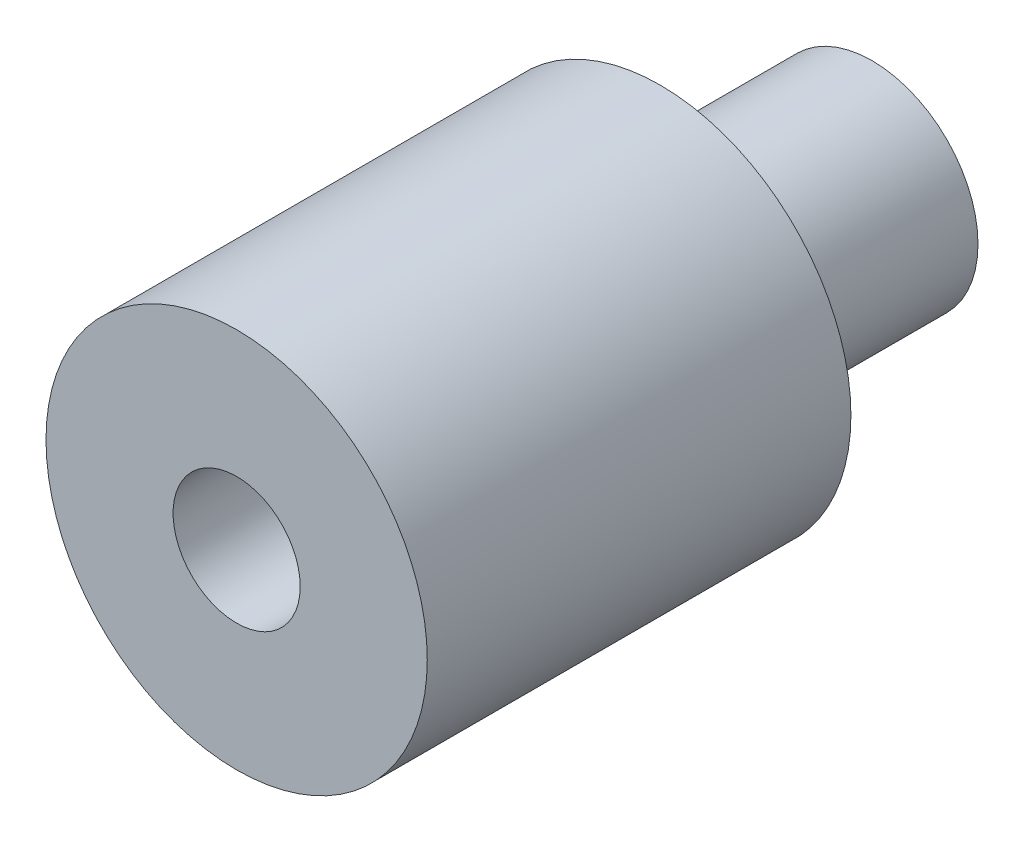
ISO-10303-21;
HEADER;
FILE_DESCRIPTION(('STEP AP214'),'2;1');
FILE_NAME('part.step','',(''),(''),'','','');
FILE_SCHEMA(('AUTOMOTIVE_DESIGN { 1 0 10303 214 1 1 1 1 }'));
ENDSEC;
DATA;
#1=APPLICATION_CONTEXT('core data for automotive mechanical design processes');
#2=APPLICATION_PROTOCOL_DEFINITION('international standard','automotive_design',2000,#1);
#3=PRODUCT_CONTEXT('',#1,'mechanical');
#4=PRODUCT('Part','Part','',(#3));
#5=PRODUCT_RELATED_PRODUCT_CATEGORY('part','',(#4));
#6=PRODUCT_DEFINITION_FORMATION('','',#4);
#7=PRODUCT_DEFINITION_CONTEXT('part definition',#1,'design');
#8=PRODUCT_DEFINITION('design','',#6,#7);
#9=PRODUCT_DEFINITION_SHAPE('','',#8);
#10=(LENGTH_UNIT() NAMED_UNIT(*) SI_UNIT(.MILLI.,.METRE.));
#11=(NAMED_UNIT(*) PLANE_ANGLE_UNIT() SI_UNIT($,.RADIAN.));
#12=(NAMED_UNIT(*) SI_UNIT($,.STERADIAN.) SOLID_ANGLE_UNIT());
#13=UNCERTAINTY_MEASURE_WITH_UNIT(LENGTH_MEASURE(1.E-05),#10,'distance_accuracy_value','');
#14=(GEOMETRIC_REPRESENTATION_CONTEXT(3) GLOBAL_UNCERTAINTY_ASSIGNED_CONTEXT((#13)) GLOBAL_UNIT_ASSIGNED_CONTEXT((#10,
#11,#12)) REPRESENTATION_CONTEXT('',''));
#15=CARTESIAN_POINT('',(0.,0.,0.));
#16=DIRECTION('',(0.,0.,1.));
#17=DIRECTION('',(1.,0.,0.));
#18=AXIS2_PLACEMENT_3D('',#15,#16,#17);
#19=CARTESIAN_POINT('',(0.,0.,5.));
#20=DIRECTION('',(0.,0.,-1.));
#21=DIRECTION('',(-1.,0.,0.));
#22=AXIS2_PLACEMENT_3D('',#19,#20,#21);
#23=CYLINDRICAL_SURFACE('',#22,2.5);
#24=CARTESIAN_POINT('',(0.,0.,5.));
#25=DIRECTION('',(0.,0.,1.));
#26=DIRECTION('',(1.,0.,0.));
#27=AXIS2_PLACEMENT_3D('',#24,#25,#26);
#28=CIRCLE('',#27,2.5);
#29=CARTESIAN_POINT('',(2.5,0.,5.));
#30=VERTEX_POINT('',#29);
#31=EDGE_CURVE('E10',#30,#30,#28,.T.);
#32=ORIENTED_EDGE('',*,*,#31,.F.);
#33=EDGE_LOOP('',(#32));
#34=FACE_BOUND('',#33,.T.);
#35=CARTESIAN_POINT('',(0.,0.,0.));
#36=DIRECTION('',(0.,0.,1.));
#37=DIRECTION('',(1.,0.,0.));
#38=AXIS2_PLACEMENT_3D('',#35,#36,#37);
#39=CIRCLE('',#38,2.5);
#40=CARTESIAN_POINT('',(2.5,0.,0.));
#41=VERTEX_POINT('',#40);
#42=EDGE_CURVE('E40',#41,#41,#39,.T.);
#43=ORIENTED_EDGE('',*,*,#42,.T.);
#44=EDGE_LOOP('',(#43));
#45=FACE_BOUND('',#44,.T.);
#46=ADVANCED_FACE('F37',(#34,#45),#23,.T.);
#47=CARTESIAN_POINT('',(0.,0.,0.));
#48=DIRECTION('',(0.,0.,1.));
#49=DIRECTION('',(1.,0.,0.));
#50=AXIS2_PLACEMENT_3D('',#47,#48,#49);
#51=PLANE('',#50);
#52=ORIENTED_EDGE('',*,*,#42,.F.);
#53=EDGE_LOOP('',(#52));
#54=FACE_BOUND('',#53,.T.);
#55=ADVANCED_FACE('F79',(#54),#51,.F.);
#56=CARTESIAN_POINT('',(0.,0.,15.));
#57=DIRECTION('',(0.,0.,-1.));
#58=DIRECTION('',(-1.,0.,0.));
#59=AXIS2_PLACEMENT_3D('',#56,#57,#58);
#60=CYLINDRICAL_SURFACE('',#59,4.5);
#61=CARTESIAN_POINT('',(0.,0.,15.));
#62=DIRECTION('',(0.,0.,1.));
#63=DIRECTION('',(1.,0.,0.));
#64=AXIS2_PLACEMENT_3D('',#61,#62,#63);
#65=CIRCLE('',#64,4.5);
#66=CARTESIAN_POINT('',(4.5,0.,15.));
#67=VERTEX_POINT('',#66);
#68=EDGE_CURVE('E47',#67,#67,#65,.T.);
#69=ORIENTED_EDGE('',*,*,#68,.F.);
#70=EDGE_LOOP('',(#69));
#71=FACE_BOUND('',#70,.T.);
#72=CARTESIAN_POINT('',(0.,0.,5.));
#73=DIRECTION('',(0.,0.,1.));
#74=DIRECTION('',(1.,0.,0.));
#75=AXIS2_PLACEMENT_3D('',#72,#73,#74);
#76=CIRCLE('',#75,4.5);
#77=CARTESIAN_POINT('',(4.5,0.,5.));
#78=VERTEX_POINT('',#77);
#79=EDGE_CURVE('E49',#78,#78,#76,.T.);
#80=ORIENTED_EDGE('',*,*,#79,.T.);
#81=EDGE_LOOP('',(#80));
#82=FACE_BOUND('',#81,.T.);
#83=ADVANCED_FACE('F73',(#71,#82),#60,.T.);
#84=CARTESIAN_POINT('',(0.,0.,15.));
#85=DIRECTION('',(0.,0.,1.));
#86=DIRECTION('',(1.,0.,0.));
#87=AXIS2_PLACEMENT_3D('',#84,#85,#86);
#88=PLANE('',#87);
#89=CARTESIAN_POINT('',(0.,0.,15.));
#90=DIRECTION('',(0.,0.,1.));
#91=DIRECTION('',(1.,0.,0.));
#92=AXIS2_PLACEMENT_3D('',#89,#90,#91);
#93=CIRCLE('',#92,1.5);
#94=CARTESIAN_POINT('',(1.5,0.,15.));
#95=VERTEX_POINT('',#94);
#96=EDGE_CURVE('E55',#95,#95,#93,.T.);
#97=ORIENTED_EDGE('',*,*,#96,.F.);
#98=EDGE_LOOP('',(#97));
#99=FACE_BOUND('',#98,.T.);
#100=ORIENTED_EDGE('',*,*,#68,.T.);
#101=EDGE_LOOP('',(#100));
#102=FACE_BOUND('',#101,.T.);
#103=ADVANCED_FACE('F70',(#99,#102),#88,.T.);
#104=CARTESIAN_POINT('',(0.,0.,5.));
#105=DIRECTION('',(0.,0.,1.));
#106=DIRECTION('',(1.,0.,0.));
#107=AXIS2_PLACEMENT_3D('',#104,#105,#106);
#108=PLANE('',#107);
#109=ORIENTED_EDGE('',*,*,#31,.T.);
#110=EDGE_LOOP('',(#109));
#111=FACE_BOUND('',#110,.T.);
#112=ORIENTED_EDGE('',*,*,#79,.F.);
#113=EDGE_LOOP('',(#112));
#114=FACE_BOUND('',#113,.T.);
#115=ADVANCED_FACE('F66',(#111,#114),#108,.F.);
#116=CARTESIAN_POINT('',(0.,0.,7.));
#117=DIRECTION('',(0.,0.,1.));
#118=DIRECTION('',(1.,0.,0.));
#119=AXIS2_PLACEMENT_3D('',#116,#117,#118);
#120=CYLINDRICAL_SURFACE('',#119,1.5);
#121=CARTESIAN_POINT('',(0.,0.,7.));
#122=DIRECTION('',(0.,0.,1.));
#123=DIRECTION('',(1.,0.,0.));
#124=AXIS2_PLACEMENT_3D('',#121,#122,#123);
#125=CIRCLE('',#124,1.5);
#126=CARTESIAN_POINT('',(1.5,0.,7.));
#127=VERTEX_POINT('',#126);
#128=EDGE_CURVE('E52',#127,#127,#125,.T.);
#129=ORIENTED_EDGE('',*,*,#128,.F.);
#130=EDGE_LOOP('',(#129));
#131=FACE_BOUND('',#130,.T.);
#132=ORIENTED_EDGE('',*,*,#96,.T.);
#133=EDGE_LOOP('',(#132));
#134=FACE_BOUND('',#133,.T.);
#135=ADVANCED_FACE('F63',(#131,#134),#120,.F.);
#136=CARTESIAN_POINT('',(0.,0.,7.));
#137=DIRECTION('',(0.,0.,1.));
#138=DIRECTION('',(1.,0.,0.));
#139=AXIS2_PLACEMENT_3D('',#136,#137,#138);
#140=PLANE('',#139);
#141=ORIENTED_EDGE('',*,*,#128,.T.);
#142=EDGE_LOOP('',(#141));
#143=FACE_BOUND('',#142,.T.);
#144=ADVANCED_FACE('F61',(#143),#140,.T.);
#145=CLOSED_SHELL('',(#46,#55,#83,#103,#115,#135,#144));
#146=MANIFOLD_SOLID_BREP('B2',#145);
#147=ADVANCED_BREP_SHAPE_REPRESENTATION('',(#18,#146),#14);
#148=SHAPE_DEFINITION_REPRESENTATION(#9,#147);
ENDSEC;
END-ISO-10303-21;
